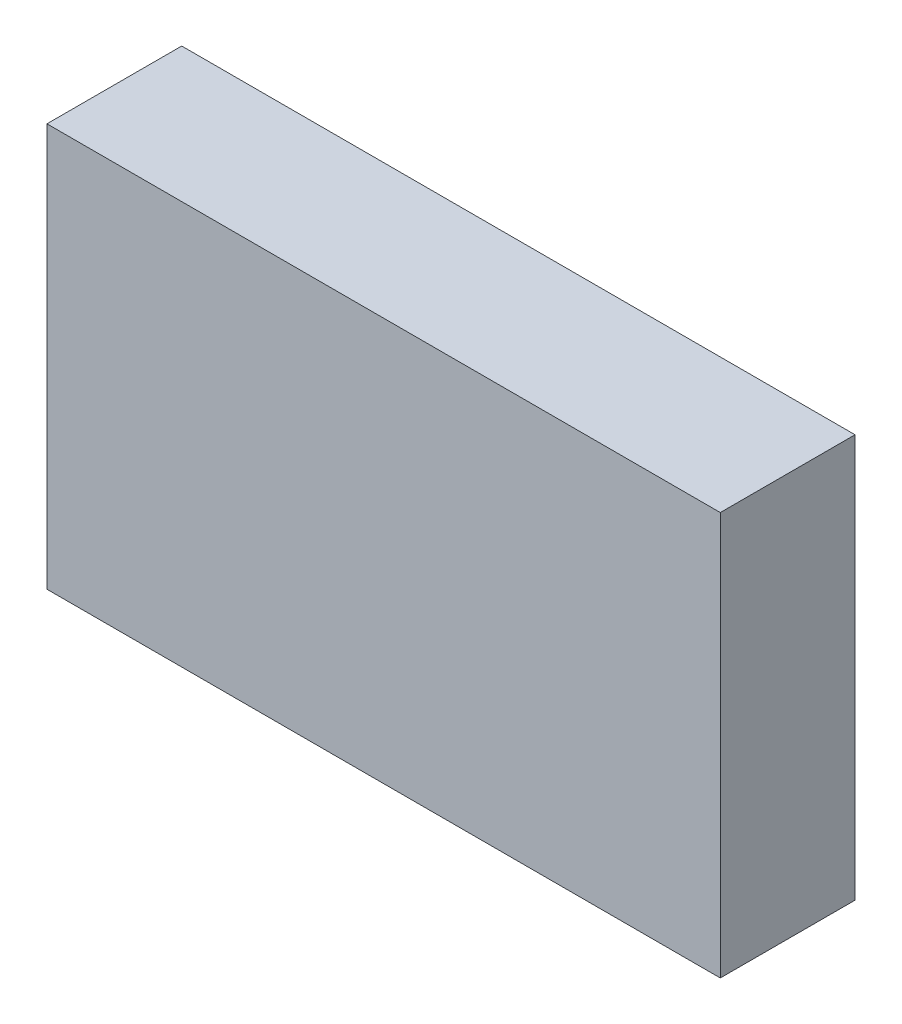
ISO-10303-21;
HEADER;
FILE_DESCRIPTION(('STEP AP214'),'2;1');
FILE_NAME('part.step','',(''),(''),'','','');
FILE_SCHEMA(('AUTOMOTIVE_DESIGN { 1 0 10303 214 1 1 1 1 }'));
ENDSEC;
DATA;
#1=APPLICATION_CONTEXT('core data for automotive mechanical design processes');
#2=APPLICATION_PROTOCOL_DEFINITION('international standard','automotive_design',2000,#1);
#3=PRODUCT_CONTEXT('',#1,'mechanical');
#4=PRODUCT('Part','Part','',(#3));
#5=PRODUCT_RELATED_PRODUCT_CATEGORY('part','',(#4));
#6=PRODUCT_DEFINITION_FORMATION('','',#4);
#7=PRODUCT_DEFINITION_CONTEXT('part definition',#1,'design');
#8=PRODUCT_DEFINITION('design','',#6,#7);
#9=PRODUCT_DEFINITION_SHAPE('','',#8);
#10=(LENGTH_UNIT() NAMED_UNIT(*) SI_UNIT(.MILLI.,.METRE.));
#11=(NAMED_UNIT(*) PLANE_ANGLE_UNIT() SI_UNIT($,.RADIAN.));
#12=(NAMED_UNIT(*) SI_UNIT($,.STERADIAN.) SOLID_ANGLE_UNIT());
#13=UNCERTAINTY_MEASURE_WITH_UNIT(LENGTH_MEASURE(1.E-05),#10,'distance_accuracy_value','');
#14=(GEOMETRIC_REPRESENTATION_CONTEXT(3) GLOBAL_UNCERTAINTY_ASSIGNED_CONTEXT((#13)) GLOBAL_UNIT_ASSIGNED_CONTEXT((#10,
#11,#12)) REPRESENTATION_CONTEXT('',''));
#15=CARTESIAN_POINT('',(0.,0.,0.));
#16=DIRECTION('',(0.,0.,1.));
#17=DIRECTION('',(1.,0.,0.));
#18=AXIS2_PLACEMENT_3D('',#15,#16,#17);
#19=CARTESIAN_POINT('',(-2.4984,-1.483,1.));
#20=DIRECTION('',(1.,0.,0.));
#21=DIRECTION('',(0.,0.,-1.));
#22=AXIS2_PLACEMENT_3D('',#19,#20,#21);
#23=PLANE('',#22);
#24=DIRECTION('',(0.,-1.,0.));
#25=VECTOR('',#24,1.);
#26=CARTESIAN_POINT('',(-2.4984,-1.483,0.));
#27=LINE('',#26,#25);
#28=CARTESIAN_POINT('',(-2.4984,1.5084,0.));
#29=VERTEX_POINT('',#28);
#30=CARTESIAN_POINT('',(-2.4984,-1.483,0.));
#31=VERTEX_POINT('',#30);
#32=EDGE_CURVE('E96',#29,#31,#27,.T.);
#33=ORIENTED_EDGE('',*,*,#32,.T.);
#34=DIRECTION('',(0.,0.,-1.));
#35=VECTOR('',#34,1.);
#36=CARTESIAN_POINT('',(-2.4984,-1.483,1.));
#37=LINE('',#36,#35);
#38=CARTESIAN_POINT('',(-2.4984,-1.483,1.));
#39=VERTEX_POINT('',#38);
#40=EDGE_CURVE('E11',#39,#31,#37,.T.);
#41=ORIENTED_EDGE('',*,*,#40,.F.);
#42=DIRECTION('',(0.,-1.,0.));
#43=VECTOR('',#42,1.);
#44=CARTESIAN_POINT('',(-2.4984,-1.483,1.));
#45=LINE('',#44,#43);
#46=CARTESIAN_POINT('',(-2.4984,1.5084,1.));
#47=VERTEX_POINT('',#46);
#48=EDGE_CURVE('E84',#47,#39,#45,.T.);
#49=ORIENTED_EDGE('',*,*,#48,.F.);
#50=DIRECTION('',(0.,0.,-1.));
#51=VECTOR('',#50,1.);
#52=CARTESIAN_POINT('',(-2.4984,1.5084,1.));
#53=LINE('',#52,#51);
#54=EDGE_CURVE('E92',#47,#29,#53,.T.);
#55=ORIENTED_EDGE('',*,*,#54,.T.);
#56=EDGE_LOOP('',(#33,#41,#49,#55));
#57=FACE_BOUND('',#56,.T.);
#58=ADVANCED_FACE('F33',(#57),#23,.F.);
#59=CARTESIAN_POINT('',(2.4984,-1.483,1.));
#60=DIRECTION('',(0.,1.,0.));
#61=DIRECTION('',(0.,0.,1.));
#62=AXIS2_PLACEMENT_3D('',#59,#60,#61);
#63=PLANE('',#62);
#64=DIRECTION('',(1.,0.,0.));
#65=VECTOR('',#64,1.);
#66=CARTESIAN_POINT('',(2.4984,-1.483,0.));
#67=LINE('',#66,#65);
#68=CARTESIAN_POINT('',(2.4984,-1.483,0.));
#69=VERTEX_POINT('',#68);
#70=EDGE_CURVE('E88',#31,#69,#67,.T.);
#71=ORIENTED_EDGE('',*,*,#70,.T.);
#72=DIRECTION('',(0.,0.,-1.));
#73=VECTOR('',#72,1.);
#74=CARTESIAN_POINT('',(2.4984,-1.483,1.));
#75=LINE('',#74,#73);
#76=CARTESIAN_POINT('',(2.4984,-1.483,1.));
#77=VERTEX_POINT('',#76);
#78=EDGE_CURVE('E41',#77,#69,#75,.T.);
#79=ORIENTED_EDGE('',*,*,#78,.F.);
#80=DIRECTION('',(1.,0.,0.));
#81=VECTOR('',#80,1.);
#82=CARTESIAN_POINT('',(2.4984,-1.483,1.));
#83=LINE('',#82,#81);
#84=EDGE_CURVE('E79',#39,#77,#83,.T.);
#85=ORIENTED_EDGE('',*,*,#84,.F.);
#86=ORIENTED_EDGE('',*,*,#40,.T.);
#87=EDGE_LOOP('',(#71,#79,#85,#86));
#88=FACE_BOUND('',#87,.T.);
#89=ADVANCED_FACE('F87',(#88),#63,.F.);
#90=CARTESIAN_POINT('',(2.4984,1.5084,1.));
#91=DIRECTION('',(-1.,0.,0.));
#92=DIRECTION('',(0.,0.,1.));
#93=AXIS2_PLACEMENT_3D('',#90,#91,#92);
#94=PLANE('',#93);
#95=DIRECTION('',(0.,1.,0.));
#96=VECTOR('',#95,1.);
#97=CARTESIAN_POINT('',(2.4984,1.5084,0.));
#98=LINE('',#97,#96);
#99=CARTESIAN_POINT('',(2.4984,1.5084,0.));
#100=VERTEX_POINT('',#99);
#101=EDGE_CURVE('E66',#69,#100,#98,.T.);
#102=ORIENTED_EDGE('',*,*,#101,.T.);
#103=DIRECTION('',(0.,0.,-1.));
#104=VECTOR('',#103,1.);
#105=CARTESIAN_POINT('',(2.4984,1.5084,1.));
#106=LINE('',#105,#104);
#107=CARTESIAN_POINT('',(2.4984,1.5084,1.));
#108=VERTEX_POINT('',#107);
#109=EDGE_CURVE('E89',#108,#100,#106,.T.);
#110=ORIENTED_EDGE('',*,*,#109,.F.);
#111=DIRECTION('',(0.,1.,0.));
#112=VECTOR('',#111,1.);
#113=CARTESIAN_POINT('',(2.4984,1.5084,1.));
#114=LINE('',#113,#112);
#115=EDGE_CURVE('E82',#77,#108,#114,.T.);
#116=ORIENTED_EDGE('',*,*,#115,.F.);
#117=ORIENTED_EDGE('',*,*,#78,.T.);
#118=EDGE_LOOP('',(#102,#110,#116,#117));
#119=FACE_BOUND('',#118,.T.);
#120=ADVANCED_FACE('F90',(#119),#94,.F.);
#121=CARTESIAN_POINT('',(-2.4984,1.5084,1.));
#122=DIRECTION('',(0.,-1.,0.));
#123=DIRECTION('',(0.,0.,-1.));
#124=AXIS2_PLACEMENT_3D('',#121,#122,#123);
#125=PLANE('',#124);
#126=DIRECTION('',(-1.,0.,0.));
#127=VECTOR('',#126,1.);
#128=CARTESIAN_POINT('',(-2.4984,1.5084,0.));
#129=LINE('',#128,#127);
#130=EDGE_CURVE('E72',#100,#29,#129,.T.);
#131=ORIENTED_EDGE('',*,*,#130,.T.);
#132=ORIENTED_EDGE('',*,*,#54,.F.);
#133=DIRECTION('',(-1.,0.,0.));
#134=VECTOR('',#133,1.);
#135=CARTESIAN_POINT('',(-2.4984,1.5084,1.));
#136=LINE('',#135,#134);
#137=EDGE_CURVE('E49',#108,#47,#136,.T.);
#138=ORIENTED_EDGE('',*,*,#137,.F.);
#139=ORIENTED_EDGE('',*,*,#109,.T.);
#140=EDGE_LOOP('',(#131,#132,#138,#139));
#141=FACE_BOUND('',#140,.T.);
#142=ADVANCED_FACE('F103',(#141),#125,.F.);
#143=CARTESIAN_POINT('',(0.,0.,1.));
#144=DIRECTION('',(0.,0.,-1.));
#145=DIRECTION('',(-1.,0.,0.));
#146=AXIS2_PLACEMENT_3D('',#143,#144,#145);
#147=PLANE('',#146);
#148=ORIENTED_EDGE('',*,*,#48,.T.);
#149=ORIENTED_EDGE('',*,*,#84,.T.);
#150=ORIENTED_EDGE('',*,*,#115,.T.);
#151=ORIENTED_EDGE('',*,*,#137,.T.);
#152=EDGE_LOOP('',(#148,#149,#150,#151));
#153=FACE_BOUND('',#152,.T.);
#154=ADVANCED_FACE('F80',(#153),#147,.F.);
#155=CARTESIAN_POINT('',(0.,0.,0.));
#156=DIRECTION('',(0.,0.,-1.));
#157=DIRECTION('',(-1.,0.,0.));
#158=AXIS2_PLACEMENT_3D('',#155,#156,#157);
#159=PLANE('',#158);
#160=ORIENTED_EDGE('',*,*,#32,.F.);
#161=ORIENTED_EDGE('',*,*,#130,.F.);
#162=ORIENTED_EDGE('',*,*,#101,.F.);
#163=ORIENTED_EDGE('',*,*,#70,.F.);
#164=EDGE_LOOP('',(#160,#161,#162,#163));
#165=FACE_BOUND('',#164,.T.);
#166=ADVANCED_FACE('F106',(#165),#159,.T.);
#167=CLOSED_SHELL('',(#58,#89,#120,#142,#154,#166));
#168=MANIFOLD_SOLID_BREP('B2',#167);
#169=ADVANCED_BREP_SHAPE_REPRESENTATION('',(#18,#168),#14);
#170=SHAPE_DEFINITION_REPRESENTATION(#9,#169);
ENDSEC;
END-ISO-10303-21;
